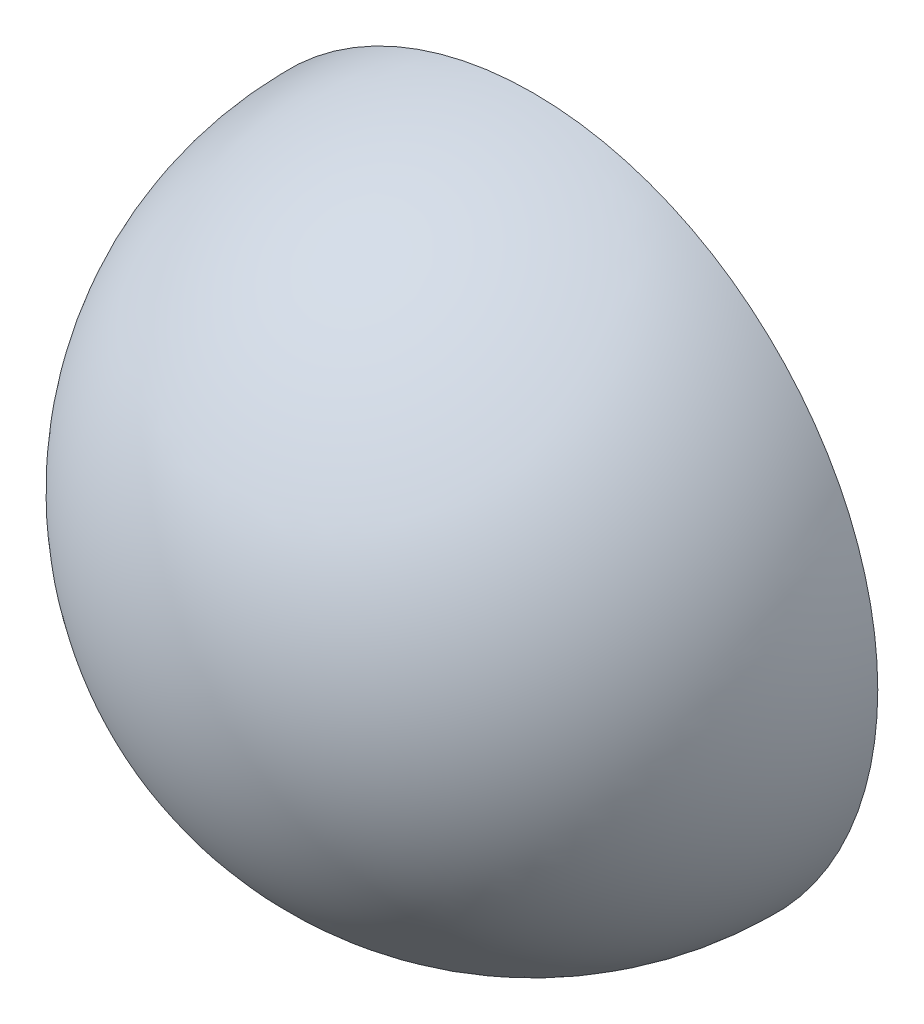
ISO-10303-21;
HEADER;
FILE_DESCRIPTION(('STEP AP214'),'2;1');
FILE_NAME('part.step','',(''),(''),'','','');
FILE_SCHEMA(('AUTOMOTIVE_DESIGN { 1 0 10303 214 1 1 1 1 }'));
ENDSEC;
DATA;
#1=APPLICATION_CONTEXT('core data for automotive mechanical design processes');
#2=APPLICATION_PROTOCOL_DEFINITION('international standard','automotive_design',2000,#1);
#3=PRODUCT_CONTEXT('',#1,'mechanical');
#4=PRODUCT('Part','Part','',(#3));
#5=PRODUCT_RELATED_PRODUCT_CATEGORY('part','',(#4));
#6=PRODUCT_DEFINITION_FORMATION('','',#4);
#7=PRODUCT_DEFINITION_CONTEXT('part definition',#1,'design');
#8=PRODUCT_DEFINITION('design','',#6,#7);
#9=PRODUCT_DEFINITION_SHAPE('','',#8);
#10=(LENGTH_UNIT() NAMED_UNIT(*) SI_UNIT(.MILLI.,.METRE.));
#11=(NAMED_UNIT(*) PLANE_ANGLE_UNIT() SI_UNIT($,.RADIAN.));
#12=(NAMED_UNIT(*) SI_UNIT($,.STERADIAN.) SOLID_ANGLE_UNIT());
#13=UNCERTAINTY_MEASURE_WITH_UNIT(LENGTH_MEASURE(1.E-05),#10,'distance_accuracy_value','');
#14=(GEOMETRIC_REPRESENTATION_CONTEXT(3) GLOBAL_UNCERTAINTY_ASSIGNED_CONTEXT((#13)) GLOBAL_UNIT_ASSIGNED_CONTEXT((#10,
#11,#12)) REPRESENTATION_CONTEXT('',''));
#15=CARTESIAN_POINT('',(0.,0.,0.));
#16=DIRECTION('',(0.,0.,1.));
#17=DIRECTION('',(1.,0.,0.));
#18=AXIS2_PLACEMENT_3D('',#15,#16,#17);
#19=CARTESIAN_POINT('',(0.,0.,0.));
#20=DIRECTION('',(0.,0.,1.));
#21=DIRECTION('',(0.,1.,0.));
#22=AXIS2_PLACEMENT_3D('',#19,#20,#21);
#23=SPHERICAL_SURFACE('',#22,40.);
#24=CARTESIAN_POINT('',(0.,0.,0.));
#25=DIRECTION('',(0.,0.,1.));
#26=DIRECTION('',(1.,0.,0.));
#27=AXIS2_PLACEMENT_3D('',#24,#25,#26);
#28=CIRCLE('',#27,40.);
#29=CARTESIAN_POINT('',(40.,0.,0.));
#30=VERTEX_POINT('',#29);
#31=EDGE_CURVE('E10',#30,#30,#28,.T.);
#32=ORIENTED_EDGE('',*,*,#31,.T.);
#33=EDGE_LOOP('',(#32));
#34=FACE_BOUND('',#33,.T.);
#35=ADVANCED_FACE('F37',(#34),#23,.T.);
#36=CARTESIAN_POINT('',(0.,0.,0.));
#37=DIRECTION('',(0.,0.,-1.));
#38=DIRECTION('',(-1.,0.,0.));
#39=AXIS2_PLACEMENT_3D('',#36,#37,#38);
#40=PLANE('',#39);
#41=ORIENTED_EDGE('',*,*,#31,.F.);
#42=EDGE_LOOP('',(#41));
#43=FACE_BOUND('',#42,.T.);
#44=ADVANCED_FACE('F45',(#43),#40,.T.);
#45=CLOSED_SHELL('',(#35,#44));
#46=MANIFOLD_SOLID_BREP('B2',#45);
#47=ADVANCED_BREP_SHAPE_REPRESENTATION('',(#18,#46),#14);
#48=SHAPE_DEFINITION_REPRESENTATION(#9,#47);
ENDSEC;
END-ISO-10303-21;
